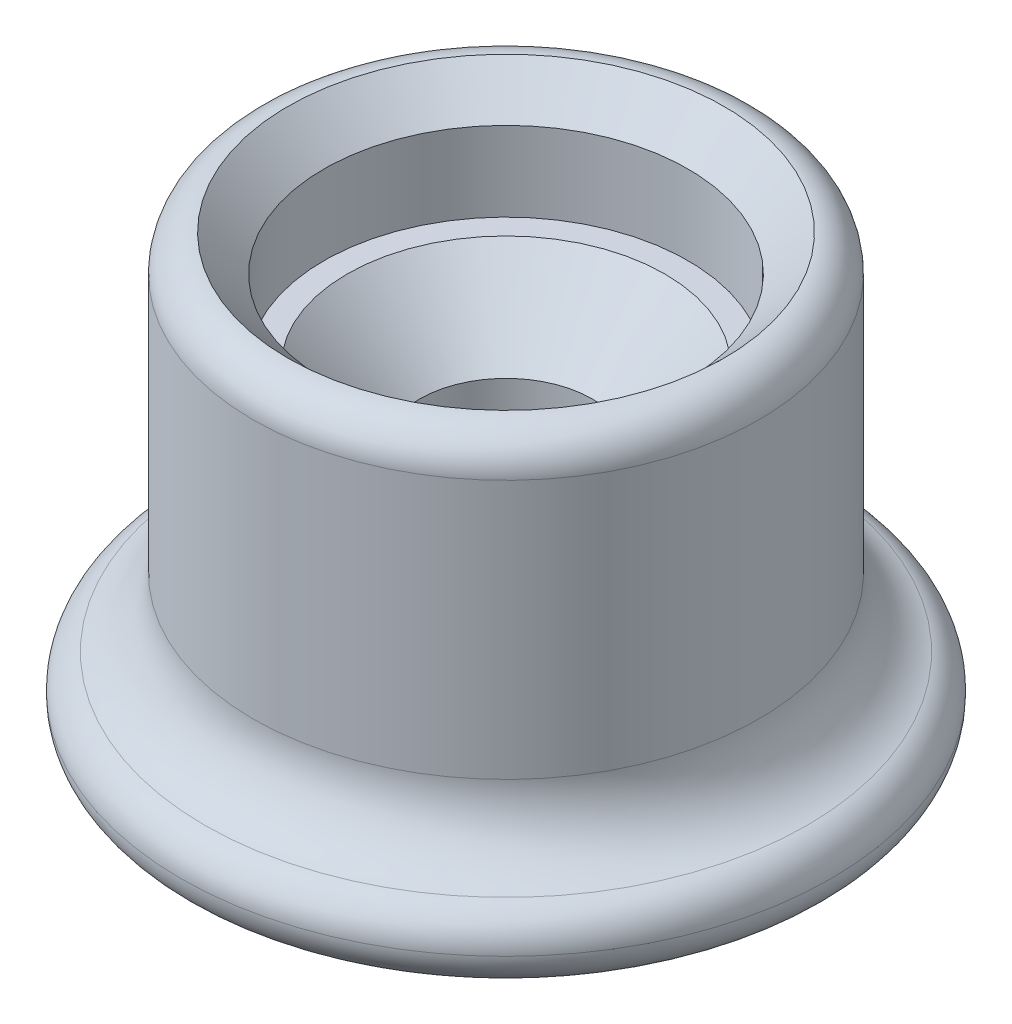
ISO-10303-21;
HEADER;
FILE_DESCRIPTION(('STEP AP214'),'2;1');
FILE_NAME('part.step','',(''),(''),'','','');
FILE_SCHEMA(('AUTOMOTIVE_DESIGN { 1 0 10303 214 1 1 1 1 }'));
ENDSEC;
DATA;
#1=APPLICATION_CONTEXT('core data for automotive mechanical design processes');
#2=APPLICATION_PROTOCOL_DEFINITION('international standard','automotive_design',2000,#1);
#3=PRODUCT_CONTEXT('',#1,'mechanical');
#4=PRODUCT('Part','Part','',(#3));
#5=PRODUCT_RELATED_PRODUCT_CATEGORY('part','',(#4));
#6=PRODUCT_DEFINITION_FORMATION('','',#4);
#7=PRODUCT_DEFINITION_CONTEXT('part definition',#1,'design');
#8=PRODUCT_DEFINITION('design','',#6,#7);
#9=PRODUCT_DEFINITION_SHAPE('','',#8);
#10=(LENGTH_UNIT() NAMED_UNIT(*) SI_UNIT(.MILLI.,.METRE.));
#11=(NAMED_UNIT(*) PLANE_ANGLE_UNIT() SI_UNIT($,.RADIAN.));
#12=(NAMED_UNIT(*) SI_UNIT($,.STERADIAN.) SOLID_ANGLE_UNIT());
#13=UNCERTAINTY_MEASURE_WITH_UNIT(LENGTH_MEASURE(1.E-05),#10,'distance_accuracy_value','');
#14=(GEOMETRIC_REPRESENTATION_CONTEXT(3) GLOBAL_UNCERTAINTY_ASSIGNED_CONTEXT((#13)) GLOBAL_UNIT_ASSIGNED_CONTEXT((#10,
#11,#12)) REPRESENTATION_CONTEXT('',''));
#15=CARTESIAN_POINT('',(0.,0.,0.));
#16=DIRECTION('',(0.,0.,1.));
#17=DIRECTION('',(1.,0.,0.));
#18=AXIS2_PLACEMENT_3D('',#15,#16,#17);
#19=CARTESIAN_POINT('',(0.,9.525,0.));
#20=DIRECTION('',(0.,-1.,0.));
#21=DIRECTION('',(0.,0.,-1.));
#22=AXIS2_PLACEMENT_3D('',#19,#20,#21);
#23=CYLINDRICAL_SURFACE('',#22,1.905);
#24=CARTESIAN_POINT('',(0.,5.3975,0.));
#25=DIRECTION('',(0.,1.,0.));
#26=DIRECTION('',(0.,0.,1.));
#27=AXIS2_PLACEMENT_3D('',#24,#25,#26);
#28=CIRCLE('',#27,1.905);
#29=CARTESIAN_POINT('',(0.,5.3975,-1.905));
#30=VERTEX_POINT('',#29);
#31=EDGE_CURVE('E53',#30,#30,#28,.T.);
#32=CARTESIAN_POINT('',(0.,0.,0.));
#33=DIRECTION('',(0.,1.,0.));
#34=DIRECTION('',(0.,0.,1.));
#35=AXIS2_PLACEMENT_3D('',#32,#33,#34);
#36=CIRCLE('',#35,1.905);
#37=CARTESIAN_POINT('',(0.,0.,-1.905));
#38=VERTEX_POINT('',#37);
#39=EDGE_CURVE('E77',#38,#38,#36,.T.);
#40=CARTESIAN_POINT('',(0.,5.3975,-1.905));
#41=CARTESIAN_POINT('',(0.,5.34127604166666,-1.905));
#42=CARTESIAN_POINT('',(0.,5.28505208333333,-1.905));
#43=CARTESIAN_POINT('',(0.,5.17260416666666,-1.905));
#44=CARTESIAN_POINT('',(0.,5.11638020833333,-1.905));
#45=CARTESIAN_POINT('',(0.,5.00393229166666,-1.905));
#46=CARTESIAN_POINT('',(0.,4.94770833333333,-1.905));
#47=CARTESIAN_POINT('',(0.,4.83526041666666,-1.905));
#48=CARTESIAN_POINT('',(0.,4.77903645833333,-1.905));
#49=CARTESIAN_POINT('',(0.,4.66658854166666,-1.905));
#50=CARTESIAN_POINT('',(0.,4.61036458333333,-1.905));
#51=CARTESIAN_POINT('',(0.,4.49791666666666,-1.905));
#52=CARTESIAN_POINT('',(0.,4.44169270833333,-1.905));
#53=CARTESIAN_POINT('',(0.,4.32924479166666,-1.905));
#54=CARTESIAN_POINT('',(0.,4.27302083333333,-1.905));
#55=CARTESIAN_POINT('',(0.,4.16057291666666,-1.905));
#56=CARTESIAN_POINT('',(0.,4.10434895833333,-1.905));
#57=CARTESIAN_POINT('',(0.,3.99190104166666,-1.905));
#58=CARTESIAN_POINT('',(0.,3.93567708333333,-1.905));
#59=CARTESIAN_POINT('',(0.,3.82322916666666,-1.905));
#60=CARTESIAN_POINT('',(0.,3.76700520833333,-1.905));
#61=CARTESIAN_POINT('',(0.,3.65455729166666,-1.905));
#62=CARTESIAN_POINT('',(0.,3.59833333333333,-1.905));
#63=CARTESIAN_POINT('',(0.,3.48588541666666,-1.905));
#64=CARTESIAN_POINT('',(0.,3.42966145833333,-1.905));
#65=CARTESIAN_POINT('',(0.,3.31721354166666,-1.905));
#66=CARTESIAN_POINT('',(0.,3.26098958333333,-1.905));
#67=CARTESIAN_POINT('',(0.,3.14854166666666,-1.905));
#68=CARTESIAN_POINT('',(0.,3.09231770833333,-1.905));
#69=CARTESIAN_POINT('',(0.,2.97986979166666,-1.905));
#70=CARTESIAN_POINT('',(0.,2.92364583333333,-1.905));
#71=CARTESIAN_POINT('',(0.,2.81119791666666,-1.905));
#72=CARTESIAN_POINT('',(0.,2.75497395833333,-1.905));
#73=CARTESIAN_POINT('',(0.,2.64252604166666,-1.905));
#74=CARTESIAN_POINT('',(0.,2.58630208333333,-1.905));
#75=CARTESIAN_POINT('',(0.,2.47385416666666,-1.905));
#76=CARTESIAN_POINT('',(0.,2.41763020833333,-1.905));
#77=CARTESIAN_POINT('',(0.,2.30518229166666,-1.905));
#78=CARTESIAN_POINT('',(0.,2.24895833333333,-1.905));
#79=CARTESIAN_POINT('',(0.,2.13651041666666,-1.905));
#80=CARTESIAN_POINT('',(0.,2.08028645833333,-1.905));
#81=CARTESIAN_POINT('',(0.,1.96783854166667,-1.905));
#82=CARTESIAN_POINT('',(0.,1.91161458333333,-1.905));
#83=CARTESIAN_POINT('',(0.,1.79916666666667,-1.905));
#84=CARTESIAN_POINT('',(0.,1.74294270833333,-1.905));
#85=CARTESIAN_POINT('',(0.,1.63049479166667,-1.905));
#86=CARTESIAN_POINT('',(0.,1.57427083333333,-1.905));
#87=CARTESIAN_POINT('',(0.,1.46182291666667,-1.905));
#88=CARTESIAN_POINT('',(0.,1.40559895833333,-1.905));
#89=CARTESIAN_POINT('',(0.,1.29315104166667,-1.905));
#90=CARTESIAN_POINT('',(0.,1.23692708333333,-1.905));
#91=CARTESIAN_POINT('',(0.,1.12447916666667,-1.905));
#92=CARTESIAN_POINT('',(0.,1.06825520833333,-1.905));
#93=CARTESIAN_POINT('',(0.,0.955807291666667,-1.905));
#94=CARTESIAN_POINT('',(0.,0.899583333333333,-1.905));
#95=CARTESIAN_POINT('',(0.,0.787135416666667,-1.905));
#96=CARTESIAN_POINT('',(0.,0.730911458333333,-1.905));
#97=CARTESIAN_POINT('',(0.,0.618463541666667,-1.905));
#98=CARTESIAN_POINT('',(0.,0.562239583333333,-1.905));
#99=CARTESIAN_POINT('',(0.,0.449791666666667,-1.905));
#100=CARTESIAN_POINT('',(0.,0.393567708333333,-1.905));
#101=CARTESIAN_POINT('',(0.,0.281119791666667,-1.905));
#102=CARTESIAN_POINT('',(0.,0.224895833333333,-1.905));
#103=CARTESIAN_POINT('',(0.,0.112447916666667,-1.905));
#104=CARTESIAN_POINT('',(0.,0.0562239583333333,-1.905));
#105=CARTESIAN_POINT('',(0.,0.,-1.905));
#106=B_SPLINE_CURVE_WITH_KNOTS('',3,(#40,#41,#42,#43,#44,#45,#46,#47,#48,#49,#50,#51,#52,#53,
#54,#55,#56,#57,#58,#59,#60,#61,#62,#63,#64,#65,#66,#67,#68,#69,#70,#71,#72,#73,#74,#75,#76,#77,
#78,#79,#80,#81,#82,#83,#84,#85,#86,#87,#88,#89,#90,#91,#92,#93,#94,#95,#96,#97,#98,#99,#100,
#101,#102,#103,#104,#105),.UNSPECIFIED.,.F.,.F.,(4,2,2,2,2,2,2,2,2,2,2,2,2,2,2,2,2,2,2,2,2,2,2,
2,2,2,2,2,2,2,2,2,4),(0.,0.168671875,0.33734375,0.506015625,0.6746875,0.843359375,1.01203125,
1.180703125,1.349375,1.518046875,1.68671875,1.855390625,2.0240625,2.192734375,2.36140625,
2.530078125,2.69875,2.867421875,3.03609375,3.204765625,3.3734375,3.542109375,3.71078125,
3.879453125,4.048125,4.216796875,4.38546875,4.554140625,4.7228125,4.891484375,5.06015625,
5.228828125,5.3975),.UNSPECIFIED.);
#107=EDGE_CURVE('BSEAM45',#30,#38,#106,.T.);
#108=ORIENTED_EDGE('',*,*,#31,.T.);
#109=ORIENTED_EDGE('',*,*,#39,.F.);
#110=ORIENTED_EDGE('',*,*,#107,.T.);
#111=ORIENTED_EDGE('',*,*,#107,.F.);
#112=EDGE_LOOP('',(#108,#110,#109,#111));
#113=FACE_BOUND('',#112,.T.);
#114=ADVANCED_FACE('F45',(#113),#23,.F.);
#115=CARTESIAN_POINT('',(0.,9.525,0.));
#116=DIRECTION('',(0.,-1.,0.));
#117=DIRECTION('',(0.,0.,-1.));
#118=AXIS2_PLACEMENT_3D('',#115,#116,#117);
#119=CYLINDRICAL_SURFACE('',#118,5.55625);
#120=CARTESIAN_POINT('',(0.,3.03881403026729,0.));
#121=DIRECTION('',(0.,-1.,0.));
#122=DIRECTION('',(0.,0.,-1.));
#123=AXIS2_PLACEMENT_3D('',#120,#121,#122);
#124=CIRCLE('',#123,5.55625);
#125=CARTESIAN_POINT('',(0.,3.03881403026729,-5.55625));
#126=VERTEX_POINT('',#125);
#127=EDGE_CURVE('E67',#126,#126,#124,.F.);
#128=CARTESIAN_POINT('',(0.,8.73125,0.));
#129=DIRECTION('',(0.,1.,0.));
#130=DIRECTION('',(0.,0.,1.));
#131=AXIS2_PLACEMENT_3D('',#128,#129,#130);
#132=CIRCLE('',#131,5.55625);
#133=CARTESIAN_POINT('',(0.,8.73125,-5.55625));
#134=VERTEX_POINT('',#133);
#135=EDGE_CURVE('E73',#134,#134,#132,.F.);
#136=CARTESIAN_POINT('',(0.,3.03881403026729,-5.55625));
#137=CARTESIAN_POINT('',(0.,3.09811023828534,-5.55625));
#138=CARTESIAN_POINT('',(0.,3.15740644630339,-5.55625));
#139=CARTESIAN_POINT('',(0.,3.27599886233949,-5.55625));
#140=CARTESIAN_POINT('',(0.,3.33529507035754,-5.55625));
#141=CARTESIAN_POINT('',(0.,3.45388748639363,-5.55625));
#142=CARTESIAN_POINT('',(0.,3.51318369441168,-5.55625));
#143=CARTESIAN_POINT('',(0.,3.63177611044778,-5.55625));
#144=CARTESIAN_POINT('',(0.,3.69107231846583,-5.55625));
#145=CARTESIAN_POINT('',(0.,3.80966473450193,-5.55625));
#146=CARTESIAN_POINT('',(0.,3.86896094251998,-5.55625));
#147=CARTESIAN_POINT('',(0.,3.98755335855608,-5.55625));
#148=CARTESIAN_POINT('',(0.,4.04684956657412,-5.55625));
#149=CARTESIAN_POINT('',(0.,4.16544198261022,-5.55625));
#150=CARTESIAN_POINT('',(0.,4.22473819062827,-5.55625));
#151=CARTESIAN_POINT('',(0.,4.34333060666437,-5.55625));
#152=CARTESIAN_POINT('',(0.,4.40262681468242,-5.55625));
#153=CARTESIAN_POINT('',(0.,4.52121923071852,-5.55625));
#154=CARTESIAN_POINT('',(0.,4.58051543873657,-5.55625));
#155=CARTESIAN_POINT('',(0.,4.69910785477266,-5.55625));
#156=CARTESIAN_POINT('',(0.,4.75840406279071,-5.55625));
#157=CARTESIAN_POINT('',(0.,4.87699647882681,-5.55625));
#158=CARTESIAN_POINT('',(0.,4.93629268684486,-5.55625));
#159=CARTESIAN_POINT('',(0.,5.05488510288096,-5.55625));
#160=CARTESIAN_POINT('',(0.,5.11418131089901,-5.55625));
#161=CARTESIAN_POINT('',(0.,5.23277372693511,-5.55625));
#162=CARTESIAN_POINT('',(0.,5.29206993495315,-5.55625));
#163=CARTESIAN_POINT('',(0.,5.41066235098925,-5.55625));
#164=CARTESIAN_POINT('',(0.,5.4699585590073,-5.55625));
#165=CARTESIAN_POINT('',(0.,5.5885509750434,-5.55625));
#166=CARTESIAN_POINT('',(0.,5.64784718306145,-5.55625));
#167=CARTESIAN_POINT('',(0.,5.76643959909755,-5.55625));
#168=CARTESIAN_POINT('',(0.,5.8257358071156,-5.55625));
#169=CARTESIAN_POINT('',(0.,5.94432822315169,-5.55625));
#170=CARTESIAN_POINT('',(0.,6.00362443116974,-5.55625));
#171=CARTESIAN_POINT('',(0.,6.12221684720584,-5.55625));
#172=CARTESIAN_POINT('',(0.,6.18151305522389,-5.55625));
#173=CARTESIAN_POINT('',(0.,6.30010547125999,-5.55625));
#174=CARTESIAN_POINT('',(0.,6.35940167927804,-5.55625));
#175=CARTESIAN_POINT('',(0.,6.47799409531414,-5.55625));
#176=CARTESIAN_POINT('',(0.,6.53729030333218,-5.55625));
#177=CARTESIAN_POINT('',(0.,6.65588271936828,-5.55625));
#178=CARTESIAN_POINT('',(0.,6.71517892738633,-5.55625));
#179=CARTESIAN_POINT('',(0.,6.83377134342243,-5.55625));
#180=CARTESIAN_POINT('',(0.,6.89306755144048,-5.55625));
#181=CARTESIAN_POINT('',(0.,7.01165996747658,-5.55625));
#182=CARTESIAN_POINT('',(0.,7.07095617549463,-5.55625));
#183=CARTESIAN_POINT('',(0.,7.18954859153073,-5.55625));
#184=CARTESIAN_POINT('',(0.,7.24884479954877,-5.55625));
#185=CARTESIAN_POINT('',(0.,7.36743721558487,-5.55625));
#186=CARTESIAN_POINT('',(0.,7.42673342360292,-5.55625));
#187=CARTESIAN_POINT('',(0.,7.54532583963902,-5.55625));
#188=CARTESIAN_POINT('',(0.,7.60462204765707,-5.55625));
#189=CARTESIAN_POINT('',(0.,7.72321446369317,-5.55625));
#190=CARTESIAN_POINT('',(0.,7.78251067171122,-5.55625));
#191=CARTESIAN_POINT('',(0.,7.90110308774731,-5.55625));
#192=CARTESIAN_POINT('',(0.,7.96039929576536,-5.55625));
#193=CARTESIAN_POINT('',(0.,8.07899171180146,-5.55625));
#194=CARTESIAN_POINT('',(0.,8.13828791981951,-5.55625));
#195=CARTESIAN_POINT('',(0.,8.25688033585561,-5.55625));
#196=CARTESIAN_POINT('',(0.,8.31617654387366,-5.55625));
#197=CARTESIAN_POINT('',(0.,8.43476895990976,-5.55625));
#198=CARTESIAN_POINT('',(0.,8.4940651679278,-5.55625));
#199=CARTESIAN_POINT('',(0.,8.6126575839639,-5.55625));
#200=CARTESIAN_POINT('',(0.,8.67195379198195,-5.55625));
#201=CARTESIAN_POINT('',(0.,8.73125,-5.55625));
#202=B_SPLINE_CURVE_WITH_KNOTS('',3,(#136,#137,#138,#139,#140,#141,#142,#143,#144,#145,#146,
#147,#148,#149,#150,#151,#152,#153,#154,#155,#156,#157,#158,#159,#160,#161,#162,#163,#164,#165,
#166,#167,#168,#169,#170,#171,#172,#173,#174,#175,#176,#177,#178,#179,#180,#181,#182,#183,#184,
#185,#186,#187,#188,#189,#190,#191,#192,#193,#194,#195,#196,#197,#198,#199,#200,#201),
.UNSPECIFIED.,.F.,.F.,(4,2,2,2,2,2,2,2,2,2,2,2,2,2,2,2,2,2,2,2,2,2,2,2,2,2,2,2,2,2,2,2,4),(0.,
0.177888624054147,0.355777248108294,0.533665872162442,0.711554496216589,0.889443120270736,
1.06733174432488,1.24522036837903,1.42310899243318,1.60099761648732,1.77888624054147,
1.95677486459562,2.13466348864977,2.31255211270391,2.49044073675806,2.66832936081221,
2.84621798486635,3.0241066089205,3.20199523297465,3.3798838570288,3.55777248108294,
3.73566110513709,3.91354972919124,4.09143835324539,4.26932697729953,4.44721560135368,
4.62510422540783,4.80299284946197,4.98088147351612,5.15877009757027,5.33665872162442,
5.51454734567856,5.69243596973271),.UNSPECIFIED.);
#203=EDGE_CURVE('BSEAM108',#126,#134,#202,.T.);
#204=ORIENTED_EDGE('',*,*,#127,.T.);
#205=ORIENTED_EDGE('',*,*,#135,.T.);
#206=ORIENTED_EDGE('',*,*,#203,.T.);
#207=ORIENTED_EDGE('',*,*,#203,.F.);
#208=EDGE_LOOP('',(#204,#206,#205,#207));
#209=FACE_BOUND('',#208,.T.);
#210=ADVANCED_FACE('F108',(#209),#119,.T.);
#211=CARTESIAN_POINT('',(0.,0.,0.));
#212=DIRECTION('',(0.,1.,0.));
#213=DIRECTION('',(0.,0.,1.));
#214=AXIS2_PLACEMENT_3D('',#211,#212,#213);
#215=PLANE('',#214);
#216=CARTESIAN_POINT('',(0.,0.,0.));
#217=DIRECTION('',(0.,1.,0.));
#218=DIRECTION('',(0.,0.,1.));
#219=AXIS2_PLACEMENT_3D('',#216,#217,#218);
#220=CIRCLE('',#219,6.35);
#221=CARTESIAN_POINT('',(0.,0.,6.35));
#222=VERTEX_POINT('',#221);
#223=EDGE_CURVE('E81',#222,#222,#220,.F.);
#224=ORIENTED_EDGE('',*,*,#223,.T.);
#225=EDGE_LOOP('',(#224));
#226=FACE_BOUND('',#225,.T.);
#227=ORIENTED_EDGE('',*,*,#39,.T.);
#228=EDGE_LOOP('',(#227));
#229=FACE_BOUND('',#228,.T.);
#230=ADVANCED_FACE('F112',(#226,#229),#215,.F.);
#231=CARTESIAN_POINT('',(0.,0.79375,0.));
#232=DIRECTION('',(0.,-1.,0.));
#233=DIRECTION('',(0.,0.,-1.));
#234=AXIS2_PLACEMENT_3D('',#231,#232,#233);
#235=TOROIDAL_SURFACE('',#234,6.35,0.79375);
#236=CARTESIAN_POINT('',(0.,1.54210467675571,0.));
#237=DIRECTION('',(0.,-1.,0.));
#238=DIRECTION('',(0.,0.,-1.));
#239=AXIS2_PLACEMENT_3D('',#236,#237,#238);
#240=CIRCLE('',#239,6.61458333333331);
#241=CARTESIAN_POINT('',(0.,1.54210467675571,-6.61458333333331));
#242=VERTEX_POINT('',#241);
#243=EDGE_CURVE('E70',#242,#242,#240,.T.);
#244=ORIENTED_EDGE('',*,*,#243,.T.);
#245=EDGE_LOOP('',(#244));
#246=FACE_BOUND('',#245,.T.);
#247=CARTESIAN_POINT('',(0.,0.79375,0.));
#248=DIRECTION('',(0.,-1.,0.));
#249=DIRECTION('',(0.,0.,-1.));
#250=AXIS2_PLACEMENT_3D('',#247,#248,#249);
#251=CIRCLE('',#250,7.14375);
#252=CARTESIAN_POINT('',(0.,0.79375,-7.14375));
#253=VERTEX_POINT('',#252);
#254=EDGE_CURVE('E74',#253,#253,#251,.T.);
#255=ORIENTED_EDGE('',*,*,#254,.F.);
#256=EDGE_LOOP('',(#255));
#257=FACE_BOUND('',#256,.T.);
#258=ADVANCED_FACE('F118',(#246,#257),#235,.T.);
#259=CARTESIAN_POINT('',(0.,0.79375,0.));
#260=DIRECTION('',(0.,1.,0.));
#261=DIRECTION('',(0.,0.,1.));
#262=AXIS2_PLACEMENT_3D('',#259,#260,#261);
#263=TOROIDAL_SURFACE('',#262,6.35,0.79375);
#264=ORIENTED_EDGE('',*,*,#254,.T.);
#265=EDGE_LOOP('',(#264));
#266=FACE_BOUND('',#265,.T.);
#267=ORIENTED_EDGE('',*,*,#223,.F.);
#268=EDGE_LOOP('',(#267));
#269=FACE_BOUND('',#268,.T.);
#270=ADVANCED_FACE('F121',(#266,#269),#263,.T.);
#271=CARTESIAN_POINT('',(0.,8.73125,0.));
#272=DIRECTION('',(0.,1.,0.));
#273=DIRECTION('',(0.,0.,1.));
#274=AXIS2_PLACEMENT_3D('',#271,#272,#273);
#275=TOROIDAL_SURFACE('',#274,4.7625,0.79375);
#276=CARTESIAN_POINT('',(0.,9.52438897079749,0.));
#277=DIRECTION('',(0.,1.,0.));
#278=DIRECTION('',(0.,0.,1.));
#279=AXIS2_PLACEMENT_3D('',#276,#277,#278);
#280=CIRCLE('',#279,4.7936389707975);
#281=CARTESIAN_POINT('',(0.,9.52438897079749,4.7936389707975));
#282=VERTEX_POINT('',#281);
#283=EDGE_CURVE('E57',#282,#282,#280,.F.);
#284=ORIENTED_EDGE('',*,*,#283,.T.);
#285=EDGE_LOOP('',(#284));
#286=FACE_BOUND('',#285,.T.);
#287=ORIENTED_EDGE('',*,*,#135,.F.);
#288=EDGE_LOOP('',(#287));
#289=FACE_BOUND('',#288,.T.);
#290=ADVANCED_FACE('F103',(#286,#289),#275,.T.);
#291=CARTESIAN_POINT('',(0.,3.03881403026729,0.));
#292=DIRECTION('',(0.,-1.,0.));
#293=DIRECTION('',(0.,0.,-1.));
#294=AXIS2_PLACEMENT_3D('',#291,#292,#293);
#295=TOROIDAL_SURFACE('',#294,7.14375,1.5875);
#296=ORIENTED_EDGE('',*,*,#127,.F.);
#297=EDGE_LOOP('',(#296));
#298=FACE_BOUND('',#297,.T.);
#299=ORIENTED_EDGE('',*,*,#243,.F.);
#300=EDGE_LOOP('',(#299));
#301=FACE_BOUND('',#300,.T.);
#302=ADVANCED_FACE('F94',(#298,#301),#295,.F.);
#303=CARTESIAN_POINT('',(0.,6.985,0.));
#304=DIRECTION('',(0.,1.,0.));
#305=DIRECTION('',(0.,0.,1.));
#306=AXIS2_PLACEMENT_3D('',#303,#304,#305);
#307=CYLINDRICAL_SURFACE('',#306,4.0005);
#308=CARTESIAN_POINT('',(0.,8.73124999999999,0.));
#309=DIRECTION('',(0.,1.,0.));
#310=DIRECTION('',(0.,0.,1.));
#311=AXIS2_PLACEMENT_3D('',#308,#309,#310);
#312=CIRCLE('',#311,4.0005);
#313=CARTESIAN_POINT('',(0.,8.73124999999999,4.0005));
#314=VERTEX_POINT('',#313);
#315=EDGE_CURVE('E61',#314,#314,#312,.T.);
#316=ORIENTED_EDGE('',*,*,#315,.T.);
#317=EDGE_LOOP('',(#316));
#318=FACE_BOUND('',#317,.T.);
#319=CARTESIAN_POINT('',(0.,6.985,0.));
#320=DIRECTION('',(0.,1.,0.));
#321=DIRECTION('',(0.,0.,1.));
#322=AXIS2_PLACEMENT_3D('',#319,#320,#321);
#323=CIRCLE('',#322,4.0005);
#324=CARTESIAN_POINT('',(0.,6.985,4.0005));
#325=VERTEX_POINT('',#324);
#326=EDGE_CURVE('E78',#325,#325,#323,.T.);
#327=ORIENTED_EDGE('',*,*,#326,.F.);
#328=EDGE_LOOP('',(#327));
#329=FACE_BOUND('',#328,.T.);
#330=ADVANCED_FACE('F92',(#318,#329),#307,.F.);
#331=CARTESIAN_POINT('',(0.,6.985,0.));
#332=DIRECTION('',(0.,1.,0.));
#333=DIRECTION('',(0.,0.,1.));
#334=AXIS2_PLACEMENT_3D('',#331,#332,#333);
#335=PLANE('',#334);
#336=CARTESIAN_POINT('',(0.,6.985,0.));
#337=DIRECTION('',(0.,1.,0.));
#338=DIRECTION('',(0.,0.,1.));
#339=AXIS2_PLACEMENT_3D('',#336,#337,#338);
#340=CIRCLE('',#339,3.49250000000001);
#341=CARTESIAN_POINT('',(0.,6.985,3.49250000000001));
#342=VERTEX_POINT('',#341);
#343=EDGE_CURVE('E10',#342,#342,#340,.F.);
#344=ORIENTED_EDGE('',*,*,#343,.T.);
#345=EDGE_LOOP('',(#344));
#346=FACE_BOUND('',#345,.T.);
#347=ORIENTED_EDGE('',*,*,#326,.T.);
#348=EDGE_LOOP('',(#347));
#349=FACE_BOUND('',#348,.T.);
#350=ADVANCED_FACE('F90',(#346,#349),#335,.T.);
#351=CARTESIAN_POINT('',(0.,8.73124999999999,0.));
#352=DIRECTION('',(0.,1.,0.));
#353=DIRECTION('',(0.,0.,1.));
#354=AXIS2_PLACEMENT_3D('',#351,#352,#353);
#355=CONICAL_SURFACE('',#354,4.0005,0.785398163397443);
#356=ORIENTED_EDGE('',*,*,#283,.F.);
#357=EDGE_LOOP('',(#356));
#358=FACE_BOUND('',#357,.T.);
#359=ORIENTED_EDGE('',*,*,#315,.F.);
#360=EDGE_LOOP('',(#359));
#361=FACE_BOUND('',#360,.T.);
#362=ADVANCED_FACE('F100',(#358,#361),#355,.F.);
#363=CARTESIAN_POINT('',(0.,5.3975,0.));
#364=DIRECTION('',(0.,1.,0.));
#365=DIRECTION('',(0.,0.,1.));
#366=AXIS2_PLACEMENT_3D('',#363,#364,#365);
#367=CONICAL_SURFACE('',#366,1.905,0.78539816339745);
#368=ORIENTED_EDGE('',*,*,#343,.F.);
#369=EDGE_LOOP('',(#368));
#370=FACE_BOUND('',#369,.T.);
#371=ORIENTED_EDGE('',*,*,#31,.F.);
#372=EDGE_LOOP('',(#371));
#373=FACE_BOUND('',#372,.T.);
#374=ADVANCED_FACE('F48',(#370,#373),#367,.F.);
#375=CLOSED_SHELL('',(#114,#210,#230,#258,#270,#290,#302,#330,#350,#362,#374));
#376=MANIFOLD_SOLID_BREP('B2',#375);
#377=ADVANCED_BREP_SHAPE_REPRESENTATION('',(#18,#376),#14);
#378=SHAPE_DEFINITION_REPRESENTATION(#9,#377);
ENDSEC;
END-ISO-10303-21;
